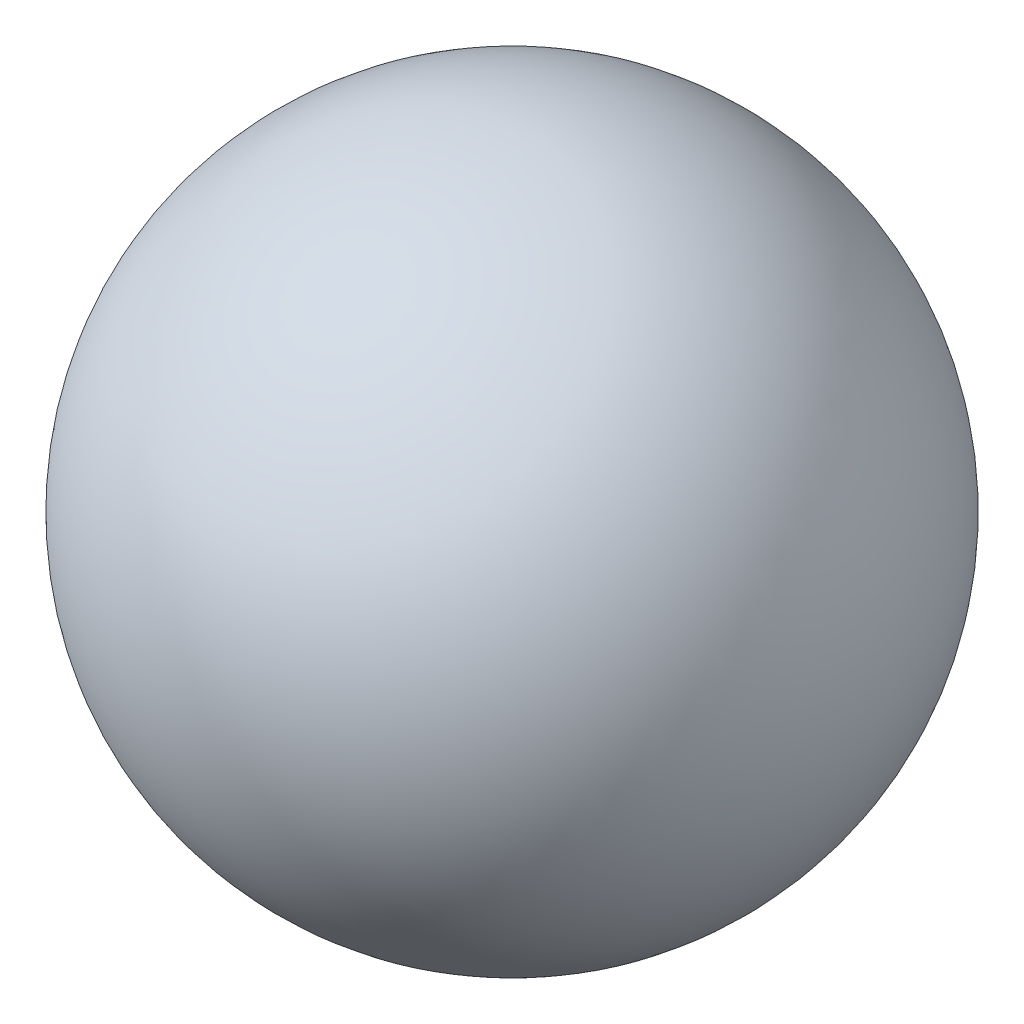
ISO-10303-21;
HEADER;
FILE_DESCRIPTION(('STEP AP214'),'2;1');
FILE_NAME('part.step','',(''),(''),'','','');
FILE_SCHEMA(('AUTOMOTIVE_DESIGN { 1 0 10303 214 1 1 1 1 }'));
ENDSEC;
DATA;
#1=APPLICATION_CONTEXT('core data for automotive mechanical design processes');
#2=APPLICATION_PROTOCOL_DEFINITION('international standard','automotive_design',2000,#1);
#3=PRODUCT_CONTEXT('',#1,'mechanical');
#4=PRODUCT('Part','Part','',(#3));
#5=PRODUCT_RELATED_PRODUCT_CATEGORY('part','',(#4));
#6=PRODUCT_DEFINITION_FORMATION('','',#4);
#7=PRODUCT_DEFINITION_CONTEXT('part definition',#1,'design');
#8=PRODUCT_DEFINITION('design','',#6,#7);
#9=PRODUCT_DEFINITION_SHAPE('','',#8);
#10=(LENGTH_UNIT() NAMED_UNIT(*) SI_UNIT(.MILLI.,.METRE.));
#11=(NAMED_UNIT(*) PLANE_ANGLE_UNIT() SI_UNIT($,.RADIAN.));
#12=(NAMED_UNIT(*) SI_UNIT($,.STERADIAN.) SOLID_ANGLE_UNIT());
#13=UNCERTAINTY_MEASURE_WITH_UNIT(LENGTH_MEASURE(1.E-05),#10,'distance_accuracy_value','');
#14=(GEOMETRIC_REPRESENTATION_CONTEXT(3) GLOBAL_UNCERTAINTY_ASSIGNED_CONTEXT((#13)) GLOBAL_UNIT_ASSIGNED_CONTEXT((#10,
#11,#12)) REPRESENTATION_CONTEXT('',''));
#15=CARTESIAN_POINT('',(0.,0.,0.));
#16=DIRECTION('',(0.,0.,1.));
#17=DIRECTION('',(1.,0.,0.));
#18=AXIS2_PLACEMENT_3D('',#15,#16,#17);
#19=CARTESIAN_POINT('',(0.,0.,0.));
#20=DIRECTION('',(0.,1.,0.));
#21=DIRECTION('',(1.,0.,0.));
#22=AXIS2_PLACEMENT_3D('',#19,#20,#21);
#23=SPHERICAL_SURFACE('',#22,50.8);
#24=CARTESIAN_POINT('',(0.,50.8,0.));
#25=VERTEX_POINT('',#24);
#26=VERTEX_LOOP('',#25);
#27=FACE_BOUND('',#26,.T.);
#28=ADVANCED_FACE('F29',(#27),#23,.T.);
#29=CLOSED_SHELL('',(#28));
#30=MANIFOLD_SOLID_BREP('B2',#29);
#31=ADVANCED_BREP_SHAPE_REPRESENTATION('',(#18,#30),#14);
#32=SHAPE_DEFINITION_REPRESENTATION(#9,#31);
ENDSEC;
END-ISO-10303-21;
